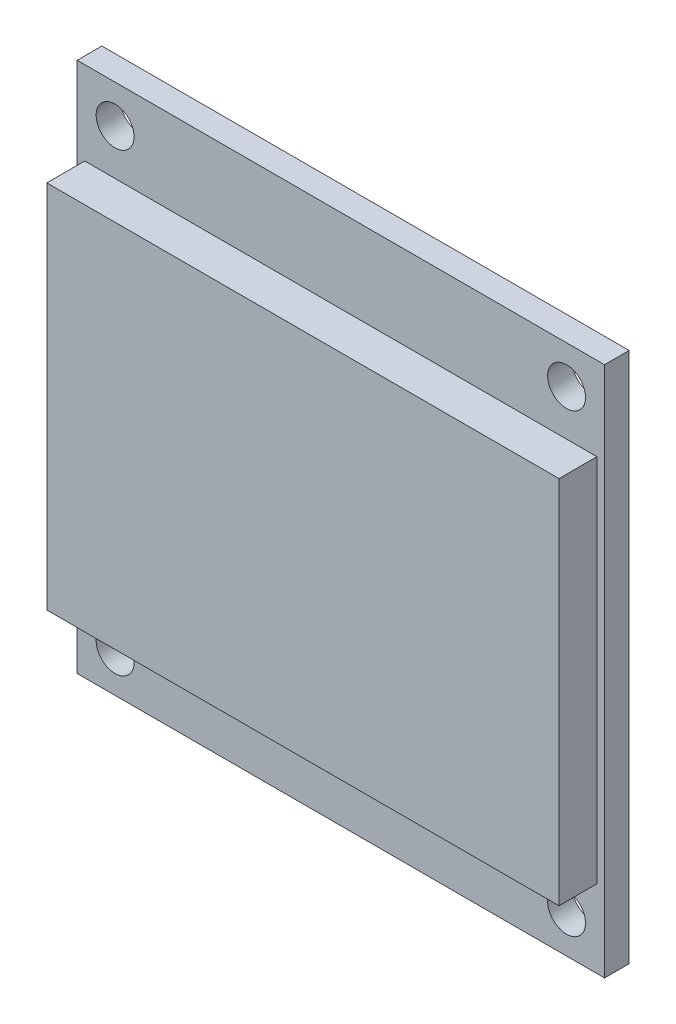
ISO-10303-21;
HEADER;
FILE_DESCRIPTION(('STEP AP214'),'2;1');
FILE_NAME('part.step','',(''),(''),'','','');
FILE_SCHEMA(('AUTOMOTIVE_DESIGN { 1 0 10303 214 1 1 1 1 }'));
ENDSEC;
DATA;
#1=APPLICATION_CONTEXT('core data for automotive mechanical design processes');
#2=APPLICATION_PROTOCOL_DEFINITION('international standard','automotive_design',2000,#1);
#3=PRODUCT_CONTEXT('',#1,'mechanical');
#4=PRODUCT('Part','Part','',(#3));
#5=PRODUCT_RELATED_PRODUCT_CATEGORY('part','',(#4));
#6=PRODUCT_DEFINITION_FORMATION('','',#4);
#7=PRODUCT_DEFINITION_CONTEXT('part definition',#1,'design');
#8=PRODUCT_DEFINITION('design','',#6,#7);
#9=PRODUCT_DEFINITION_SHAPE('','',#8);
#10=(LENGTH_UNIT() NAMED_UNIT(*) SI_UNIT(.MILLI.,.METRE.));
#11=(NAMED_UNIT(*) PLANE_ANGLE_UNIT() SI_UNIT($,.RADIAN.));
#12=(NAMED_UNIT(*) SI_UNIT($,.STERADIAN.) SOLID_ANGLE_UNIT());
#13=UNCERTAINTY_MEASURE_WITH_UNIT(LENGTH_MEASURE(1.E-05),#10,'distance_accuracy_value','');
#14=(GEOMETRIC_REPRESENTATION_CONTEXT(3) GLOBAL_UNCERTAINTY_ASSIGNED_CONTEXT((#13)) GLOBAL_UNIT_ASSIGNED_CONTEXT((#10,
#11,#12)) REPRESENTATION_CONTEXT('',''));
#15=CARTESIAN_POINT('',(0.,0.,0.));
#16=DIRECTION('',(0.,0.,1.));
#17=DIRECTION('',(1.,0.,0.));
#18=AXIS2_PLACEMENT_3D('',#15,#16,#17);
#19=CARTESIAN_POINT('',(0.,0.,1.3));
#20=DIRECTION('',(0.,0.,-1.));
#21=DIRECTION('',(-1.,0.,0.));
#22=AXIS2_PLACEMENT_3D('',#19,#20,#21);
#23=PLANE('',#22);
#24=CARTESIAN_POINT('',(2.,2.,1.3));
#25=DIRECTION('',(0.,0.,1.));
#26=DIRECTION('',(1.,0.,0.));
#27=AXIS2_PLACEMENT_3D('',#24,#25,#26);
#28=CIRCLE('',#27,1.);
#29=CARTESIAN_POINT('',(3.,2.,1.3));
#30=VERTEX_POINT('',#29);
#31=EDGE_CURVE('E124',#30,#30,#28,.T.);
#32=ORIENTED_EDGE('',*,*,#31,.F.);
#33=EDGE_LOOP('',(#32));
#34=FACE_BOUND('',#33,.T.);
#35=CARTESIAN_POINT('',(25.8,2.,1.3));
#36=DIRECTION('',(0.,0.,1.));
#37=DIRECTION('',(1.,0.,0.));
#38=AXIS2_PLACEMENT_3D('',#35,#36,#37);
#39=CIRCLE('',#38,1.);
#40=CARTESIAN_POINT('',(26.8,2.,1.3));
#41=VERTEX_POINT('',#40);
#42=EDGE_CURVE('E133',#41,#41,#39,.T.);
#43=ORIENTED_EDGE('',*,*,#42,.F.);
#44=EDGE_LOOP('',(#43));
#45=FACE_BOUND('',#44,.T.);
#46=CARTESIAN_POINT('',(2.,26.,1.3));
#47=DIRECTION('',(0.,0.,1.));
#48=DIRECTION('',(1.,0.,0.));
#49=AXIS2_PLACEMENT_3D('',#46,#47,#48);
#50=CIRCLE('',#49,1.);
#51=CARTESIAN_POINT('',(3.,26.,1.3));
#52=VERTEX_POINT('',#51);
#53=EDGE_CURVE('E139',#52,#52,#50,.T.);
#54=ORIENTED_EDGE('',*,*,#53,.F.);
#55=EDGE_LOOP('',(#54));
#56=FACE_BOUND('',#55,.T.);
#57=CARTESIAN_POINT('',(25.8,26.,1.3));
#58=DIRECTION('',(0.,0.,1.));
#59=DIRECTION('',(1.,0.,0.));
#60=AXIS2_PLACEMENT_3D('',#57,#58,#59);
#61=CIRCLE('',#60,1.);
#62=CARTESIAN_POINT('',(26.8,26.,1.3));
#63=VERTEX_POINT('',#62);
#64=EDGE_CURVE('E145',#63,#63,#61,.T.);
#65=ORIENTED_EDGE('',*,*,#64,.F.);
#66=EDGE_LOOP('',(#65));
#67=FACE_BOUND('',#66,.T.);
#68=DIRECTION('',(0.,-1.,0.));
#69=VECTOR('',#68,1.);
#70=CARTESIAN_POINT('',(0.,0.,1.3));
#71=LINE('',#70,#69);
#72=CARTESIAN_POINT('',(0.,28.,1.3));
#73=VERTEX_POINT('',#72);
#74=CARTESIAN_POINT('',(0.,0.,1.3));
#75=VERTEX_POINT('',#74);
#76=EDGE_CURVE('E151',#73,#75,#71,.T.);
#77=ORIENTED_EDGE('',*,*,#76,.T.);
#78=DIRECTION('',(1.,0.,0.));
#79=VECTOR('',#78,1.);
#80=CARTESIAN_POINT('',(0.,0.,1.3));
#81=LINE('',#80,#79);
#82=CARTESIAN_POINT('',(27.8,0.,1.3));
#83=VERTEX_POINT('',#82);
#84=EDGE_CURVE('E154',#75,#83,#81,.T.);
#85=ORIENTED_EDGE('',*,*,#84,.T.);
#86=DIRECTION('',(0.,1.,0.));
#87=VECTOR('',#86,1.);
#88=CARTESIAN_POINT('',(27.8,0.,1.3));
#89=LINE('',#88,#87);
#90=CARTESIAN_POINT('',(27.8,28.,1.3));
#91=VERTEX_POINT('',#90);
#92=EDGE_CURVE('E157',#83,#91,#89,.T.);
#93=ORIENTED_EDGE('',*,*,#92,.T.);
#94=DIRECTION('',(-1.,0.,0.));
#95=VECTOR('',#94,1.);
#96=CARTESIAN_POINT('',(0.,28.,1.3));
#97=LINE('',#96,#95);
#98=EDGE_CURVE('E159',#91,#73,#97,.T.);
#99=ORIENTED_EDGE('',*,*,#98,.T.);
#100=EDGE_LOOP('',(#77,#85,#93,#99));
#101=FACE_BOUND('',#100,.T.);
#102=DIRECTION('',(0.,-1.,0.));
#103=VECTOR('',#102,1.);
#104=CARTESIAN_POINT('',(0.4,23.6,1.3));
#105=LINE('',#104,#103);
#106=CARTESIAN_POINT('',(0.4,23.6,1.3));
#107=VERTEX_POINT('',#106);
#108=CARTESIAN_POINT('',(0.400000000000003,4.1,1.3));
#109=VERTEX_POINT('',#108);
#110=EDGE_CURVE('E120',#107,#109,#105,.T.);
#111=ORIENTED_EDGE('',*,*,#110,.F.);
#112=DIRECTION('',(-1.,0.,0.));
#113=VECTOR('',#112,1.);
#114=CARTESIAN_POINT('',(0.4,23.6,1.3));
#115=LINE('',#114,#113);
#116=CARTESIAN_POINT('',(27.4,23.6,1.3));
#117=VERTEX_POINT('',#116);
#118=EDGE_CURVE('E117',#117,#107,#115,.T.);
#119=ORIENTED_EDGE('',*,*,#118,.F.);
#120=DIRECTION('',(0.,1.,0.));
#121=VECTOR('',#120,1.);
#122=CARTESIAN_POINT('',(27.4,23.6,1.3));
#123=LINE('',#122,#121);
#124=CARTESIAN_POINT('',(27.4,4.1,1.3));
#125=VERTEX_POINT('',#124);
#126=EDGE_CURVE('E55',#125,#117,#123,.T.);
#127=ORIENTED_EDGE('',*,*,#126,.F.);
#128=DIRECTION('',(1.,0.,0.));
#129=VECTOR('',#128,1.);
#130=CARTESIAN_POINT('',(0.400000000000003,4.1,1.3));
#131=LINE('',#130,#129);
#132=EDGE_CURVE('E50',#109,#125,#131,.T.);
#133=ORIENTED_EDGE('',*,*,#132,.F.);
#134=EDGE_LOOP('',(#111,#119,#127,#133));
#135=FACE_BOUND('',#134,.T.);
#136=ADVANCED_FACE('F35',(#34,#45,#56,#67,#101,#135),#23,.F.);
#137=CARTESIAN_POINT('',(0.,0.,0.));
#138=DIRECTION('',(0.,0.,-1.));
#139=DIRECTION('',(-1.,0.,0.));
#140=AXIS2_PLACEMENT_3D('',#137,#138,#139);
#141=PLANE('',#140);
#142=CARTESIAN_POINT('',(25.8,2.,0.));
#143=DIRECTION('',(0.,0.,1.));
#144=DIRECTION('',(1.,0.,0.));
#145=AXIS2_PLACEMENT_3D('',#142,#143,#144);
#146=CIRCLE('',#145,1.);
#147=CARTESIAN_POINT('',(26.8,2.,0.));
#148=VERTEX_POINT('',#147);
#149=EDGE_CURVE('E131',#148,#148,#146,.T.);
#150=ORIENTED_EDGE('',*,*,#149,.T.);
#151=EDGE_LOOP('',(#150));
#152=FACE_BOUND('',#151,.T.);
#153=CARTESIAN_POINT('',(25.8,26.,0.));
#154=DIRECTION('',(0.,0.,1.));
#155=DIRECTION('',(1.,0.,0.));
#156=AXIS2_PLACEMENT_3D('',#153,#154,#155);
#157=CIRCLE('',#156,1.);
#158=CARTESIAN_POINT('',(26.8,26.,0.));
#159=VERTEX_POINT('',#158);
#160=EDGE_CURVE('E142',#159,#159,#157,.T.);
#161=ORIENTED_EDGE('',*,*,#160,.T.);
#162=EDGE_LOOP('',(#161));
#163=FACE_BOUND('',#162,.T.);
#164=DIRECTION('',(0.,-1.,0.));
#165=VECTOR('',#164,1.);
#166=CARTESIAN_POINT('',(0.,0.,0.));
#167=LINE('',#166,#165);
#168=CARTESIAN_POINT('',(0.,28.,0.));
#169=VERTEX_POINT('',#168);
#170=CARTESIAN_POINT('',(0.,0.,0.));
#171=VERTEX_POINT('',#170);
#172=EDGE_CURVE('E148',#169,#171,#167,.T.);
#173=ORIENTED_EDGE('',*,*,#172,.F.);
#174=DIRECTION('',(-1.,0.,0.));
#175=VECTOR('',#174,1.);
#176=CARTESIAN_POINT('',(0.,28.,0.));
#177=LINE('',#176,#175);
#178=CARTESIAN_POINT('',(27.8,28.,0.));
#179=VERTEX_POINT('',#178);
#180=EDGE_CURVE('E155',#179,#169,#177,.T.);
#181=ORIENTED_EDGE('',*,*,#180,.F.);
#182=DIRECTION('',(0.,1.,0.));
#183=VECTOR('',#182,1.);
#184=CARTESIAN_POINT('',(27.8,0.,0.));
#185=LINE('',#184,#183);
#186=CARTESIAN_POINT('',(27.8,0.,0.));
#187=VERTEX_POINT('',#186);
#188=EDGE_CURVE('E166',#187,#179,#185,.T.);
#189=ORIENTED_EDGE('',*,*,#188,.F.);
#190=DIRECTION('',(1.,0.,0.));
#191=VECTOR('',#190,1.);
#192=CARTESIAN_POINT('',(0.,0.,0.));
#193=LINE('',#192,#191);
#194=EDGE_CURVE('E164',#171,#187,#193,.T.);
#195=ORIENTED_EDGE('',*,*,#194,.F.);
#196=EDGE_LOOP('',(#173,#181,#189,#195));
#197=FACE_BOUND('',#196,.T.);
#198=CARTESIAN_POINT('',(2.,26.,0.));
#199=DIRECTION('',(0.,0.,1.));
#200=DIRECTION('',(1.,0.,0.));
#201=AXIS2_PLACEMENT_3D('',#198,#199,#200);
#202=CIRCLE('',#201,1.);
#203=CARTESIAN_POINT('',(3.,26.,0.));
#204=VERTEX_POINT('',#203);
#205=EDGE_CURVE('E136',#204,#204,#202,.T.);
#206=ORIENTED_EDGE('',*,*,#205,.T.);
#207=EDGE_LOOP('',(#206));
#208=FACE_BOUND('',#207,.T.);
#209=CARTESIAN_POINT('',(2.,2.,0.));
#210=DIRECTION('',(0.,0.,1.));
#211=DIRECTION('',(1.,0.,0.));
#212=AXIS2_PLACEMENT_3D('',#209,#210,#211);
#213=CIRCLE('',#212,1.);
#214=CARTESIAN_POINT('',(3.,2.,0.));
#215=VERTEX_POINT('',#214);
#216=EDGE_CURVE('E121',#215,#215,#213,.T.);
#217=ORIENTED_EDGE('',*,*,#216,.T.);
#218=EDGE_LOOP('',(#217));
#219=FACE_BOUND('',#218,.T.);
#220=ADVANCED_FACE('F184',(#152,#163,#197,#208,#219),#141,.T.);
#221=CARTESIAN_POINT('',(0.,0.,1.3));
#222=DIRECTION('',(1.,0.,0.));
#223=DIRECTION('',(0.,0.,-1.));
#224=AXIS2_PLACEMENT_3D('',#221,#222,#223);
#225=PLANE('',#224);
#226=ORIENTED_EDGE('',*,*,#172,.T.);
#227=DIRECTION('',(0.,0.,-1.));
#228=VECTOR('',#227,1.);
#229=CARTESIAN_POINT('',(0.,0.,1.3));
#230=LINE('',#229,#228);
#231=EDGE_CURVE('E11',#75,#171,#230,.T.);
#232=ORIENTED_EDGE('',*,*,#231,.F.);
#233=ORIENTED_EDGE('',*,*,#76,.F.);
#234=DIRECTION('',(0.,0.,-1.));
#235=VECTOR('',#234,1.);
#236=CARTESIAN_POINT('',(0.,28.,1.3));
#237=LINE('',#236,#235);
#238=EDGE_CURVE('E161',#73,#169,#237,.T.);
#239=ORIENTED_EDGE('',*,*,#238,.T.);
#240=EDGE_LOOP('',(#226,#232,#233,#239));
#241=FACE_BOUND('',#240,.T.);
#242=ADVANCED_FACE('F37',(#241),#225,.F.);
#243=CARTESIAN_POINT('',(0.,0.,1.3));
#244=DIRECTION('',(0.,1.,0.));
#245=DIRECTION('',(0.,0.,1.));
#246=AXIS2_PLACEMENT_3D('',#243,#244,#245);
#247=PLANE('',#246);
#248=ORIENTED_EDGE('',*,*,#194,.T.);
#249=DIRECTION('',(0.,0.,-1.));
#250=VECTOR('',#249,1.);
#251=CARTESIAN_POINT('',(27.8,0.,1.3));
#252=LINE('',#251,#250);
#253=EDGE_CURVE('E43',#83,#187,#252,.T.);
#254=ORIENTED_EDGE('',*,*,#253,.F.);
#255=ORIENTED_EDGE('',*,*,#84,.F.);
#256=ORIENTED_EDGE('',*,*,#231,.T.);
#257=EDGE_LOOP('',(#248,#254,#255,#256));
#258=FACE_BOUND('',#257,.T.);
#259=ADVANCED_FACE('F194',(#258),#247,.F.);
#260=CARTESIAN_POINT('',(27.8,0.,1.3));
#261=DIRECTION('',(-1.,0.,0.));
#262=DIRECTION('',(0.,0.,1.));
#263=AXIS2_PLACEMENT_3D('',#260,#261,#262);
#264=PLANE('',#263);
#265=ORIENTED_EDGE('',*,*,#188,.T.);
#266=DIRECTION('',(0.,0.,-1.));
#267=VECTOR('',#266,1.);
#268=CARTESIAN_POINT('',(27.8,28.,1.3));
#269=LINE('',#268,#267);
#270=EDGE_CURVE('E171',#91,#179,#269,.T.);
#271=ORIENTED_EDGE('',*,*,#270,.F.);
#272=ORIENTED_EDGE('',*,*,#92,.F.);
#273=ORIENTED_EDGE('',*,*,#253,.T.);
#274=EDGE_LOOP('',(#265,#271,#272,#273));
#275=FACE_BOUND('',#274,.T.);
#276=ADVANCED_FACE('F178',(#275),#264,.F.);
#277=CARTESIAN_POINT('',(0.,28.,1.3));
#278=DIRECTION('',(0.,-1.,0.));
#279=DIRECTION('',(0.,0.,-1.));
#280=AXIS2_PLACEMENT_3D('',#277,#278,#279);
#281=PLANE('',#280);
#282=ORIENTED_EDGE('',*,*,#180,.T.);
#283=ORIENTED_EDGE('',*,*,#238,.F.);
#284=ORIENTED_EDGE('',*,*,#98,.F.);
#285=ORIENTED_EDGE('',*,*,#270,.T.);
#286=EDGE_LOOP('',(#282,#283,#284,#285));
#287=FACE_BOUND('',#286,.T.);
#288=ADVANCED_FACE('F188',(#287),#281,.F.);
#289=CARTESIAN_POINT('',(25.8,26.,1.3));
#290=DIRECTION('',(0.,0.,-1.));
#291=DIRECTION('',(-1.,0.,0.));
#292=AXIS2_PLACEMENT_3D('',#289,#290,#291);
#293=CYLINDRICAL_SURFACE('',#292,1.);
#294=ORIENTED_EDGE('',*,*,#64,.T.);
#295=EDGE_LOOP('',(#294));
#296=FACE_BOUND('',#295,.T.);
#297=ORIENTED_EDGE('',*,*,#160,.F.);
#298=EDGE_LOOP('',(#297));
#299=FACE_BOUND('',#298,.T.);
#300=ADVANCED_FACE('F212',(#296,#299),#293,.F.);
#301=CARTESIAN_POINT('',(2.,26.,1.3));
#302=DIRECTION('',(0.,0.,-1.));
#303=DIRECTION('',(-1.,0.,0.));
#304=AXIS2_PLACEMENT_3D('',#301,#302,#303);
#305=CYLINDRICAL_SURFACE('',#304,1.);
#306=ORIENTED_EDGE('',*,*,#53,.T.);
#307=EDGE_LOOP('',(#306));
#308=FACE_BOUND('',#307,.T.);
#309=ORIENTED_EDGE('',*,*,#205,.F.);
#310=EDGE_LOOP('',(#309));
#311=FACE_BOUND('',#310,.T.);
#312=ADVANCED_FACE('F219',(#308,#311),#305,.F.);
#313=CARTESIAN_POINT('',(25.8,2.,1.3));
#314=DIRECTION('',(0.,0.,-1.));
#315=DIRECTION('',(-1.,0.,0.));
#316=AXIS2_PLACEMENT_3D('',#313,#314,#315);
#317=CYLINDRICAL_SURFACE('',#316,1.);
#318=ORIENTED_EDGE('',*,*,#42,.T.);
#319=EDGE_LOOP('',(#318));
#320=FACE_BOUND('',#319,.T.);
#321=ORIENTED_EDGE('',*,*,#149,.F.);
#322=EDGE_LOOP('',(#321));
#323=FACE_BOUND('',#322,.T.);
#324=ADVANCED_FACE('F224',(#320,#323),#317,.F.);
#325=CARTESIAN_POINT('',(2.,2.,1.3));
#326=DIRECTION('',(0.,0.,-1.));
#327=DIRECTION('',(-1.,0.,0.));
#328=AXIS2_PLACEMENT_3D('',#325,#326,#327);
#329=CYLINDRICAL_SURFACE('',#328,1.);
#330=ORIENTED_EDGE('',*,*,#31,.T.);
#331=EDGE_LOOP('',(#330));
#332=FACE_BOUND('',#331,.T.);
#333=ORIENTED_EDGE('',*,*,#216,.F.);
#334=EDGE_LOOP('',(#333));
#335=FACE_BOUND('',#334,.T.);
#336=ADVANCED_FACE('F234',(#332,#335),#329,.F.);
#337=CARTESIAN_POINT('',(0.4,23.6,3.3));
#338=DIRECTION('',(1.,0.,0.));
#339=DIRECTION('',(0.,1.,0.));
#340=AXIS2_PLACEMENT_3D('',#337,#338,#339);
#341=PLANE('',#340);
#342=ORIENTED_EDGE('',*,*,#110,.T.);
#343=DIRECTION('',(0.,0.,-1.));
#344=VECTOR('',#343,1.);
#345=CARTESIAN_POINT('',(0.400000000000003,4.1,3.3));
#346=LINE('',#345,#344);
#347=CARTESIAN_POINT('',(0.400000000000003,4.1,3.3));
#348=VERTEX_POINT('',#347);
#349=EDGE_CURVE('E101',#348,#109,#346,.T.);
#350=ORIENTED_EDGE('',*,*,#349,.F.);
#351=DIRECTION('',(0.,-1.,0.));
#352=VECTOR('',#351,1.);
#353=CARTESIAN_POINT('',(0.4,23.6,3.3));
#354=LINE('',#353,#352);
#355=CARTESIAN_POINT('',(0.4,23.6,3.3));
#356=VERTEX_POINT('',#355);
#357=EDGE_CURVE('E108',#356,#348,#354,.T.);
#358=ORIENTED_EDGE('',*,*,#357,.F.);
#359=DIRECTION('',(0.,0.,-1.));
#360=VECTOR('',#359,1.);
#361=CARTESIAN_POINT('',(0.4,23.6,3.3));
#362=LINE('',#361,#360);
#363=EDGE_CURVE('E339',#356,#107,#362,.T.);
#364=ORIENTED_EDGE('',*,*,#363,.T.);
#365=EDGE_LOOP('',(#342,#350,#358,#364));
#366=FACE_BOUND('',#365,.T.);
#367=ADVANCED_FACE('F119',(#366),#341,.F.);
#368=CARTESIAN_POINT('',(0.400000000000003,4.1,3.3));
#369=DIRECTION('',(0.,1.,0.));
#370=DIRECTION('',(0.,0.,1.));
#371=AXIS2_PLACEMENT_3D('',#368,#369,#370);
#372=PLANE('',#371);
#373=ORIENTED_EDGE('',*,*,#132,.T.);
#374=DIRECTION('',(0.,0.,-1.));
#375=VECTOR('',#374,1.);
#376=CARTESIAN_POINT('',(27.4,4.1,3.3));
#377=LINE('',#376,#375);
#378=CARTESIAN_POINT('',(27.4,4.1,3.3));
#379=VERTEX_POINT('',#378);
#380=EDGE_CURVE('E104',#379,#125,#377,.T.);
#381=ORIENTED_EDGE('',*,*,#380,.F.);
#382=DIRECTION('',(1.,0.,0.));
#383=VECTOR('',#382,1.);
#384=CARTESIAN_POINT('',(0.400000000000003,4.1,3.3));
#385=LINE('',#384,#383);
#386=EDGE_CURVE('E97',#348,#379,#385,.T.);
#387=ORIENTED_EDGE('',*,*,#386,.F.);
#388=ORIENTED_EDGE('',*,*,#349,.T.);
#389=EDGE_LOOP('',(#373,#381,#387,#388));
#390=FACE_BOUND('',#389,.T.);
#391=ADVANCED_FACE('F99',(#390),#372,.F.);
#392=CARTESIAN_POINT('',(27.4,23.6,3.3));
#393=DIRECTION('',(-1.,0.,0.));
#394=DIRECTION('',(0.,-1.,0.));
#395=AXIS2_PLACEMENT_3D('',#392,#393,#394);
#396=PLANE('',#395);
#397=ORIENTED_EDGE('',*,*,#126,.T.);
#398=DIRECTION('',(0.,0.,-1.));
#399=VECTOR('',#398,1.);
#400=CARTESIAN_POINT('',(27.4,23.6,3.3));
#401=LINE('',#400,#399);
#402=CARTESIAN_POINT('',(27.4,23.6,3.3));
#403=VERTEX_POINT('',#402);
#404=EDGE_CURVE('E126',#403,#117,#401,.T.);
#405=ORIENTED_EDGE('',*,*,#404,.F.);
#406=DIRECTION('',(0.,1.,0.));
#407=VECTOR('',#406,1.);
#408=CARTESIAN_POINT('',(27.4,23.6,3.3));
#409=LINE('',#408,#407);
#410=EDGE_CURVE('E107',#379,#403,#409,.T.);
#411=ORIENTED_EDGE('',*,*,#410,.F.);
#412=ORIENTED_EDGE('',*,*,#380,.T.);
#413=EDGE_LOOP('',(#397,#405,#411,#412));
#414=FACE_BOUND('',#413,.T.);
#415=ADVANCED_FACE('F246',(#414),#396,.F.);
#416=CARTESIAN_POINT('',(0.4,23.6,3.3));
#417=DIRECTION('',(0.,-1.,0.));
#418=DIRECTION('',(1.,0.,0.));
#419=AXIS2_PLACEMENT_3D('',#416,#417,#418);
#420=PLANE('',#419);
#421=ORIENTED_EDGE('',*,*,#118,.T.);
#422=ORIENTED_EDGE('',*,*,#363,.F.);
#423=DIRECTION('',(-1.,0.,0.));
#424=VECTOR('',#423,1.);
#425=CARTESIAN_POINT('',(0.4,23.6,3.3));
#426=LINE('',#425,#424);
#427=EDGE_CURVE('E113',#403,#356,#426,.T.);
#428=ORIENTED_EDGE('',*,*,#427,.F.);
#429=ORIENTED_EDGE('',*,*,#404,.T.);
#430=EDGE_LOOP('',(#421,#422,#428,#429));
#431=FACE_BOUND('',#430,.T.);
#432=ADVANCED_FACE('F249',(#431),#420,.F.);
#433=CARTESIAN_POINT('',(0.,0.,3.3));
#434=DIRECTION('',(0.,0.,1.));
#435=DIRECTION('',(1.,0.,0.));
#436=AXIS2_PLACEMENT_3D('',#433,#434,#435);
#437=PLANE('',#436);
#438=ORIENTED_EDGE('',*,*,#357,.T.);
#439=ORIENTED_EDGE('',*,*,#386,.T.);
#440=ORIENTED_EDGE('',*,*,#410,.T.);
#441=ORIENTED_EDGE('',*,*,#427,.T.);
#442=EDGE_LOOP('',(#438,#439,#440,#441));
#443=FACE_BOUND('',#442,.T.);
#444=ADVANCED_FACE('F111',(#443),#437,.T.);
#445=CLOSED_SHELL('',(#136,#220,#242,#259,#276,#288,#300,#312,#324,#336,#367,#391,#415,#432,#444));
#446=MANIFOLD_SOLID_BREP('B2',#445);
#447=ADVANCED_BREP_SHAPE_REPRESENTATION('',(#18,#446),#14);
#448=SHAPE_DEFINITION_REPRESENTATION(#9,#447);
ENDSEC;
END-ISO-10303-21;
